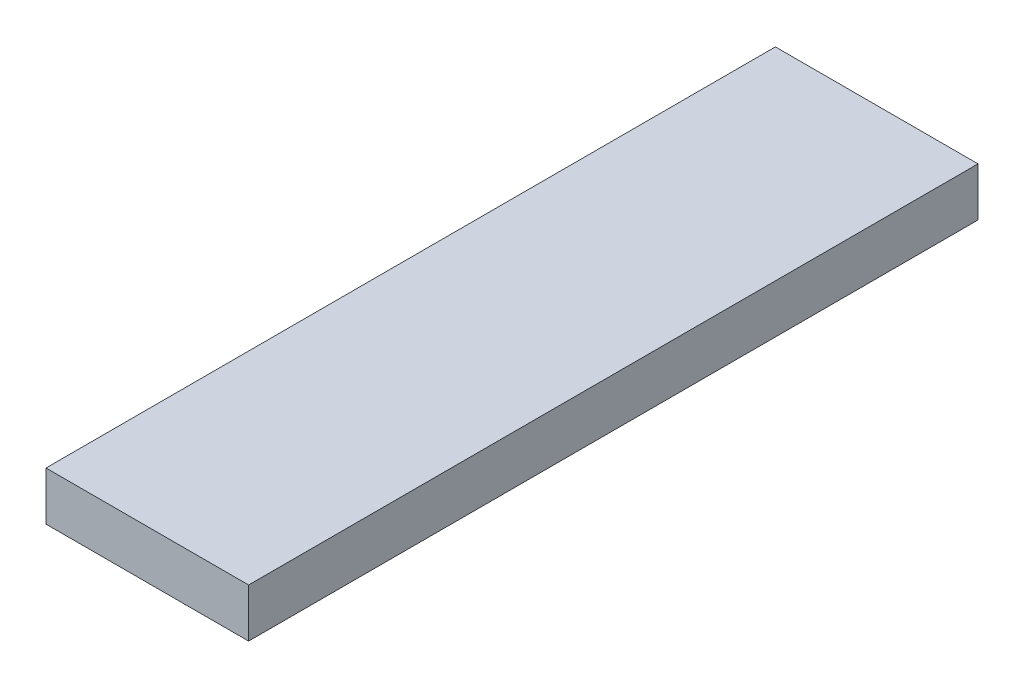
ISO-10303-21;
HEADER;
FILE_DESCRIPTION(('STEP AP214'),'2;1');
FILE_NAME('part.step','',(''),(''),'','','');
FILE_SCHEMA(('AUTOMOTIVE_DESIGN { 1 0 10303 214 1 1 1 1 }'));
ENDSEC;
DATA;
#1=APPLICATION_CONTEXT('core data for automotive mechanical design processes');
#2=APPLICATION_PROTOCOL_DEFINITION('international standard','automotive_design',2000,#1);
#3=PRODUCT_CONTEXT('',#1,'mechanical');
#4=PRODUCT('Part','Part','',(#3));
#5=PRODUCT_RELATED_PRODUCT_CATEGORY('part','',(#4));
#6=PRODUCT_DEFINITION_FORMATION('','',#4);
#7=PRODUCT_DEFINITION_CONTEXT('part definition',#1,'design');
#8=PRODUCT_DEFINITION('design','',#6,#7);
#9=PRODUCT_DEFINITION_SHAPE('','',#8);
#10=(LENGTH_UNIT() NAMED_UNIT(*) SI_UNIT(.MILLI.,.METRE.));
#11=(NAMED_UNIT(*) PLANE_ANGLE_UNIT() SI_UNIT($,.RADIAN.));
#12=(NAMED_UNIT(*) SI_UNIT($,.STERADIAN.) SOLID_ANGLE_UNIT());
#13=UNCERTAINTY_MEASURE_WITH_UNIT(LENGTH_MEASURE(1.E-05),#10,'distance_accuracy_value','');
#14=(GEOMETRIC_REPRESENTATION_CONTEXT(3) GLOBAL_UNCERTAINTY_ASSIGNED_CONTEXT((#13)) GLOBAL_UNIT_ASSIGNED_CONTEXT((#10,
#11,#12)) REPRESENTATION_CONTEXT('',''));
#15=CARTESIAN_POINT('',(0.,0.,0.));
#16=DIRECTION('',(0.,0.,1.));
#17=DIRECTION('',(1.,0.,0.));
#18=AXIS2_PLACEMENT_3D('',#15,#16,#17);
#19=CARTESIAN_POINT('',(12.5,6.,-45.));
#20=DIRECTION('',(-1.,0.,0.));
#21=DIRECTION('',(0.,0.,1.));
#22=AXIS2_PLACEMENT_3D('',#19,#20,#21);
#23=PLANE('',#22);
#24=DIRECTION('',(0.,0.,-1.));
#25=VECTOR('',#24,1.);
#26=CARTESIAN_POINT('',(12.5,0.,-45.));
#27=LINE('',#26,#25);
#28=CARTESIAN_POINT('',(12.5,0.,45.));
#29=VERTEX_POINT('',#28);
#30=CARTESIAN_POINT('',(12.5,0.,-45.));
#31=VERTEX_POINT('',#30);
#32=EDGE_CURVE('E96',#29,#31,#27,.T.);
#33=ORIENTED_EDGE('',*,*,#32,.T.);
#34=DIRECTION('',(0.,-1.,0.));
#35=VECTOR('',#34,1.);
#36=CARTESIAN_POINT('',(12.5,6.,-45.));
#37=LINE('',#36,#35);
#38=CARTESIAN_POINT('',(12.5,6.,-45.));
#39=VERTEX_POINT('',#38);
#40=EDGE_CURVE('E11',#39,#31,#37,.T.);
#41=ORIENTED_EDGE('',*,*,#40,.F.);
#42=DIRECTION('',(0.,0.,-1.));
#43=VECTOR('',#42,1.);
#44=CARTESIAN_POINT('',(12.5,6.,-45.));
#45=LINE('',#44,#43);
#46=CARTESIAN_POINT('',(12.5,6.,45.));
#47=VERTEX_POINT('',#46);
#48=EDGE_CURVE('E84',#47,#39,#45,.T.);
#49=ORIENTED_EDGE('',*,*,#48,.F.);
#50=DIRECTION('',(0.,-1.,0.));
#51=VECTOR('',#50,1.);
#52=CARTESIAN_POINT('',(12.5,6.,45.));
#53=LINE('',#52,#51);
#54=EDGE_CURVE('E92',#47,#29,#53,.T.);
#55=ORIENTED_EDGE('',*,*,#54,.T.);
#56=EDGE_LOOP('',(#33,#41,#49,#55));
#57=FACE_BOUND('',#56,.T.);
#58=ADVANCED_FACE('F33',(#57),#23,.F.);
#59=CARTESIAN_POINT('',(-12.5,6.,-45.));
#60=DIRECTION('',(0.,0.,1.));
#61=DIRECTION('',(1.,0.,0.));
#62=AXIS2_PLACEMENT_3D('',#59,#60,#61);
#63=PLANE('',#62);
#64=DIRECTION('',(-1.,0.,0.));
#65=VECTOR('',#64,1.);
#66=CARTESIAN_POINT('',(-12.5,0.,-45.));
#67=LINE('',#66,#65);
#68=CARTESIAN_POINT('',(-12.5,0.,-45.));
#69=VERTEX_POINT('',#68);
#70=EDGE_CURVE('E88',#31,#69,#67,.T.);
#71=ORIENTED_EDGE('',*,*,#70,.T.);
#72=DIRECTION('',(0.,-1.,0.));
#73=VECTOR('',#72,1.);
#74=CARTESIAN_POINT('',(-12.5,6.,-45.));
#75=LINE('',#74,#73);
#76=CARTESIAN_POINT('',(-12.5,6.,-45.));
#77=VERTEX_POINT('',#76);
#78=EDGE_CURVE('E41',#77,#69,#75,.T.);
#79=ORIENTED_EDGE('',*,*,#78,.F.);
#80=DIRECTION('',(-1.,0.,0.));
#81=VECTOR('',#80,1.);
#82=CARTESIAN_POINT('',(-12.5,6.,-45.));
#83=LINE('',#82,#81);
#84=EDGE_CURVE('E79',#39,#77,#83,.T.);
#85=ORIENTED_EDGE('',*,*,#84,.F.);
#86=ORIENTED_EDGE('',*,*,#40,.T.);
#87=EDGE_LOOP('',(#71,#79,#85,#86));
#88=FACE_BOUND('',#87,.T.);
#89=ADVANCED_FACE('F87',(#88),#63,.F.);
#90=CARTESIAN_POINT('',(-12.5,6.,-45.));
#91=DIRECTION('',(1.,0.,0.));
#92=DIRECTION('',(0.,0.,-1.));
#93=AXIS2_PLACEMENT_3D('',#90,#91,#92);
#94=PLANE('',#93);
#95=DIRECTION('',(0.,0.,1.));
#96=VECTOR('',#95,1.);
#97=CARTESIAN_POINT('',(-12.5,0.,-45.));
#98=LINE('',#97,#96);
#99=CARTESIAN_POINT('',(-12.5,0.,45.));
#100=VERTEX_POINT('',#99);
#101=EDGE_CURVE('E66',#69,#100,#98,.T.);
#102=ORIENTED_EDGE('',*,*,#101,.T.);
#103=DIRECTION('',(0.,-1.,0.));
#104=VECTOR('',#103,1.);
#105=CARTESIAN_POINT('',(-12.5,6.,45.));
#106=LINE('',#105,#104);
#107=CARTESIAN_POINT('',(-12.5,6.,45.));
#108=VERTEX_POINT('',#107);
#109=EDGE_CURVE('E89',#108,#100,#106,.T.);
#110=ORIENTED_EDGE('',*,*,#109,.F.);
#111=DIRECTION('',(0.,0.,1.));
#112=VECTOR('',#111,1.);
#113=CARTESIAN_POINT('',(-12.5,6.,-45.));
#114=LINE('',#113,#112);
#115=EDGE_CURVE('E82',#77,#108,#114,.T.);
#116=ORIENTED_EDGE('',*,*,#115,.F.);
#117=ORIENTED_EDGE('',*,*,#78,.T.);
#118=EDGE_LOOP('',(#102,#110,#116,#117));
#119=FACE_BOUND('',#118,.T.);
#120=ADVANCED_FACE('F90',(#119),#94,.F.);
#121=CARTESIAN_POINT('',(-12.5,6.,45.));
#122=DIRECTION('',(0.,0.,-1.));
#123=DIRECTION('',(-1.,0.,0.));
#124=AXIS2_PLACEMENT_3D('',#121,#122,#123);
#125=PLANE('',#124);
#126=DIRECTION('',(1.,0.,0.));
#127=VECTOR('',#126,1.);
#128=CARTESIAN_POINT('',(-12.5,0.,45.));
#129=LINE('',#128,#127);
#130=EDGE_CURVE('E72',#100,#29,#129,.T.);
#131=ORIENTED_EDGE('',*,*,#130,.T.);
#132=ORIENTED_EDGE('',*,*,#54,.F.);
#133=DIRECTION('',(1.,0.,0.));
#134=VECTOR('',#133,1.);
#135=CARTESIAN_POINT('',(-12.5,6.,45.));
#136=LINE('',#135,#134);
#137=EDGE_CURVE('E49',#108,#47,#136,.T.);
#138=ORIENTED_EDGE('',*,*,#137,.F.);
#139=ORIENTED_EDGE('',*,*,#109,.T.);
#140=EDGE_LOOP('',(#131,#132,#138,#139));
#141=FACE_BOUND('',#140,.T.);
#142=ADVANCED_FACE('F103',(#141),#125,.F.);
#143=CARTESIAN_POINT('',(0.,6.,0.));
#144=DIRECTION('',(0.,1.,0.));
#145=DIRECTION('',(0.,0.,1.));
#146=AXIS2_PLACEMENT_3D('',#143,#144,#145);
#147=PLANE('',#146);
#148=ORIENTED_EDGE('',*,*,#48,.T.);
#149=ORIENTED_EDGE('',*,*,#84,.T.);
#150=ORIENTED_EDGE('',*,*,#115,.T.);
#151=ORIENTED_EDGE('',*,*,#137,.T.);
#152=EDGE_LOOP('',(#148,#149,#150,#151));
#153=FACE_BOUND('',#152,.T.);
#154=ADVANCED_FACE('F80',(#153),#147,.T.);
#155=CARTESIAN_POINT('',(0.,0.,0.));
#156=DIRECTION('',(0.,1.,0.));
#157=DIRECTION('',(0.,0.,1.));
#158=AXIS2_PLACEMENT_3D('',#155,#156,#157);
#159=PLANE('',#158);
#160=ORIENTED_EDGE('',*,*,#32,.F.);
#161=ORIENTED_EDGE('',*,*,#130,.F.);
#162=ORIENTED_EDGE('',*,*,#101,.F.);
#163=ORIENTED_EDGE('',*,*,#70,.F.);
#164=EDGE_LOOP('',(#160,#161,#162,#163));
#165=FACE_BOUND('',#164,.T.);
#166=ADVANCED_FACE('F106',(#165),#159,.F.);
#167=CLOSED_SHELL('',(#58,#89,#120,#142,#154,#166));
#168=MANIFOLD_SOLID_BREP('B2',#167);
#169=ADVANCED_BREP_SHAPE_REPRESENTATION('',(#18,#168),#14);
#170=SHAPE_DEFINITION_REPRESENTATION(#9,#169);
ENDSEC;
END-ISO-10303-21;
